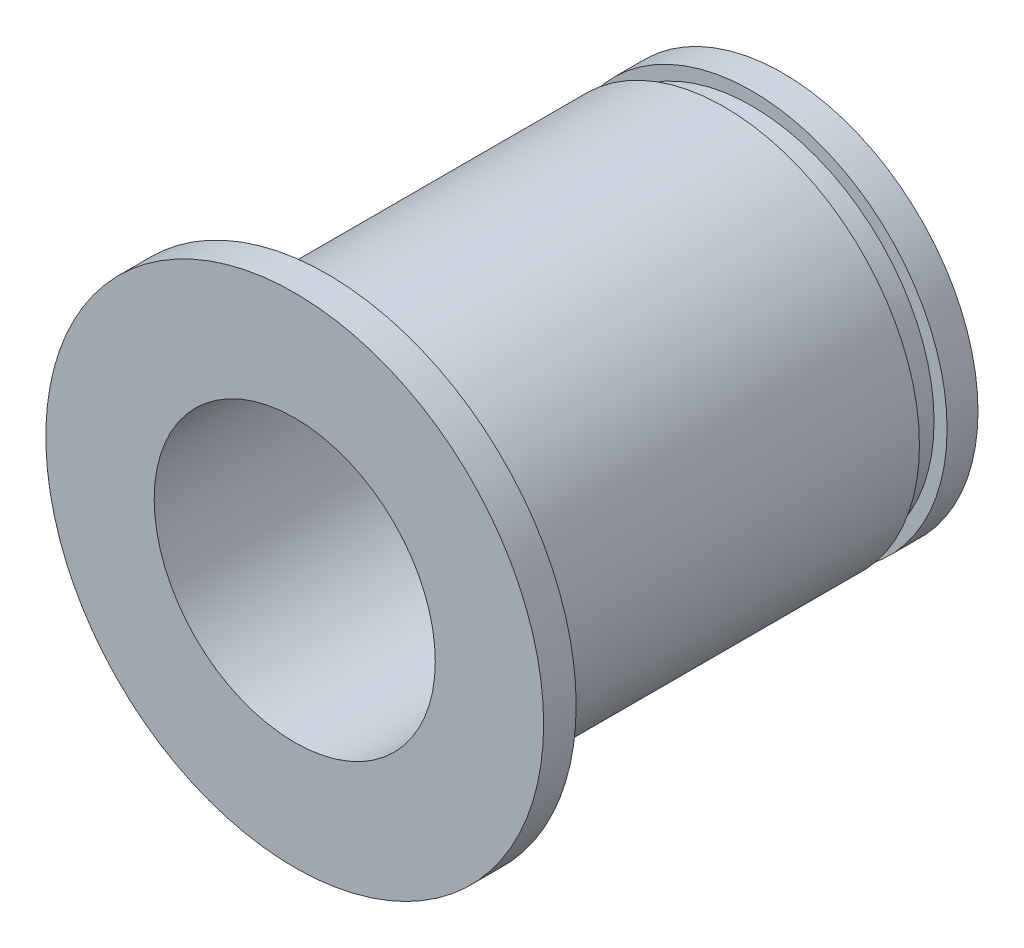
ISO-10303-21;
HEADER;
FILE_DESCRIPTION(('STEP AP214'),'2;1');
FILE_NAME('part.step','',(''),(''),'','','');
FILE_SCHEMA(('AUTOMOTIVE_DESIGN { 1 0 10303 214 1 1 1 1 }'));
ENDSEC;
DATA;
#1=APPLICATION_CONTEXT('core data for automotive mechanical design processes');
#2=APPLICATION_PROTOCOL_DEFINITION('international standard','automotive_design',2000,#1);
#3=PRODUCT_CONTEXT('',#1,'mechanical');
#4=PRODUCT('Part','Part','',(#3));
#5=PRODUCT_RELATED_PRODUCT_CATEGORY('part','',(#4));
#6=PRODUCT_DEFINITION_FORMATION('','',#4);
#7=PRODUCT_DEFINITION_CONTEXT('part definition',#1,'design');
#8=PRODUCT_DEFINITION('design','',#6,#7);
#9=PRODUCT_DEFINITION_SHAPE('','',#8);
#10=(LENGTH_UNIT() NAMED_UNIT(*) SI_UNIT(.MILLI.,.METRE.));
#11=(NAMED_UNIT(*) PLANE_ANGLE_UNIT() SI_UNIT($,.RADIAN.));
#12=(NAMED_UNIT(*) SI_UNIT($,.STERADIAN.) SOLID_ANGLE_UNIT());
#13=UNCERTAINTY_MEASURE_WITH_UNIT(LENGTH_MEASURE(1.E-05),#10,'distance_accuracy_value','');
#14=(GEOMETRIC_REPRESENTATION_CONTEXT(3) GLOBAL_UNCERTAINTY_ASSIGNED_CONTEXT((#13)) GLOBAL_UNIT_ASSIGNED_CONTEXT((#10,
#11,#12)) REPRESENTATION_CONTEXT('',''));
#15=CARTESIAN_POINT('',(0.,0.,0.));
#16=DIRECTION('',(0.,0.,1.));
#17=DIRECTION('',(1.,0.,0.));
#18=AXIS2_PLACEMENT_3D('',#15,#16,#17);
#19=CARTESIAN_POINT('',(0.,0.,12.));
#20=DIRECTION('',(0.,0.,-1.));
#21=DIRECTION('',(-1.,0.,0.));
#22=AXIS2_PLACEMENT_3D('',#19,#20,#21);
#23=CYLINDRICAL_SURFACE('',#22,6.);
#24=CARTESIAN_POINT('',(0.,0.,-2.));
#25=DIRECTION('',(0.,0.,1.));
#26=DIRECTION('',(1.,0.,0.));
#27=AXIS2_PLACEMENT_3D('',#24,#25,#26);
#28=CIRCLE('',#27,6.);
#29=CARTESIAN_POINT('',(6.,0.,-2.));
#30=VERTEX_POINT('',#29);
#31=EDGE_CURVE('E44',#30,#30,#28,.T.);
#32=ORIENTED_EDGE('',*,*,#31,.T.);
#33=EDGE_LOOP('',(#32));
#34=FACE_BOUND('',#33,.T.);
#35=CARTESIAN_POINT('',(0.,0.,-1.05));
#36=DIRECTION('',(0.,0.,1.));
#37=DIRECTION('',(1.,0.,0.));
#38=AXIS2_PLACEMENT_3D('',#35,#36,#37);
#39=CIRCLE('',#38,6.);
#40=CARTESIAN_POINT('',(6.,0.,-1.05));
#41=VERTEX_POINT('',#40);
#42=EDGE_CURVE('E53',#41,#41,#39,.T.);
#43=ORIENTED_EDGE('',*,*,#42,.F.);
#44=EDGE_LOOP('',(#43));
#45=FACE_BOUND('',#44,.T.);
#46=ADVANCED_FACE('F40',(#34,#45),#23,.T.);
#47=CARTESIAN_POINT('',(0.,0.,-2.));
#48=DIRECTION('',(0.,0.,1.));
#49=DIRECTION('',(1.,0.,0.));
#50=AXIS2_PLACEMENT_3D('',#47,#48,#49);
#51=PLANE('',#50);
#52=ORIENTED_EDGE('',*,*,#31,.F.);
#53=EDGE_LOOP('',(#52));
#54=FACE_BOUND('',#53,.T.);
#55=CARTESIAN_POINT('',(0.,0.,-2.));
#56=DIRECTION('',(0.,0.,1.));
#57=DIRECTION('',(1.,0.,0.));
#58=AXIS2_PLACEMENT_3D('',#55,#56,#57);
#59=CIRCLE('',#58,4.32);
#60=CARTESIAN_POINT('',(4.32,0.,-2.));
#61=VERTEX_POINT('',#60);
#62=EDGE_CURVE('E49',#61,#61,#59,.T.);
#63=ORIENTED_EDGE('',*,*,#62,.T.);
#64=EDGE_LOOP('',(#63));
#65=FACE_BOUND('',#64,.T.);
#66=ADVANCED_FACE('F94',(#54,#65),#51,.F.);
#67=CARTESIAN_POINT('',(0.,0.,-0.200000000000001));
#68=DIRECTION('',(0.,0.,1.));
#69=DIRECTION('',(1.,0.,0.));
#70=AXIS2_PLACEMENT_3D('',#67,#68,#69);
#71=CIRCLE('',#70,6.);
#72=CARTESIAN_POINT('',(6.,0.,-0.200000000000001));
#73=VERTEX_POINT('',#72);
#74=EDGE_CURVE('E41',#73,#73,#71,.T.);
#75=ORIENTED_EDGE('',*,*,#74,.T.);
#76=EDGE_LOOP('',(#75));
#77=FACE_BOUND('',#76,.T.);
#78=CARTESIAN_POINT('',(0.,0.,12.));
#79=DIRECTION('',(0.,0.,1.));
#80=DIRECTION('',(1.,0.,0.));
#81=AXIS2_PLACEMENT_3D('',#78,#79,#80);
#82=CIRCLE('',#81,6.);
#83=CARTESIAN_POINT('',(6.,0.,12.));
#84=VERTEX_POINT('',#83);
#85=EDGE_CURVE('E10',#84,#84,#82,.T.);
#86=ORIENTED_EDGE('',*,*,#85,.F.);
#87=EDGE_LOOP('',(#86));
#88=FACE_BOUND('',#87,.T.);
#89=ADVANCED_FACE('F39',(#77,#88),#23,.T.);
#90=CARTESIAN_POINT('',(0.,0.,12.));
#91=DIRECTION('',(0.,0.,-1.));
#92=DIRECTION('',(-1.,0.,0.));
#93=AXIS2_PLACEMENT_3D('',#90,#91,#92);
#94=CYLINDRICAL_SURFACE('',#93,4.32);
#95=ORIENTED_EDGE('',*,*,#62,.F.);
#96=EDGE_LOOP('',(#95));
#97=FACE_BOUND('',#96,.T.);
#98=CARTESIAN_POINT('',(0.,0.,13.));
#99=DIRECTION('',(0.,0.,1.));
#100=DIRECTION('',(1.,0.,0.));
#101=AXIS2_PLACEMENT_3D('',#98,#99,#100);
#102=CIRCLE('',#101,4.32);
#103=CARTESIAN_POINT('',(4.32,0.,13.));
#104=VERTEX_POINT('',#103);
#105=EDGE_CURVE('E58',#104,#104,#102,.T.);
#106=ORIENTED_EDGE('',*,*,#105,.T.);
#107=EDGE_LOOP('',(#106));
#108=FACE_BOUND('',#107,.T.);
#109=ADVANCED_FACE('F89',(#97,#108),#94,.F.);
#110=CARTESIAN_POINT('',(0.,0.,13.));
#111=DIRECTION('',(0.,0.,1.));
#112=DIRECTION('',(1.,0.,0.));
#113=AXIS2_PLACEMENT_3D('',#110,#111,#112);
#114=PLANE('',#113);
#115=CARTESIAN_POINT('',(0.,0.,13.));
#116=DIRECTION('',(0.,0.,1.));
#117=DIRECTION('',(1.,0.,0.));
#118=AXIS2_PLACEMENT_3D('',#115,#116,#117);
#119=CIRCLE('',#118,7.65);
#120=CARTESIAN_POINT('',(7.65,0.,13.));
#121=VERTEX_POINT('',#120);
#122=EDGE_CURVE('E75',#121,#121,#119,.T.);
#123=ORIENTED_EDGE('',*,*,#122,.T.);
#124=EDGE_LOOP('',(#123));
#125=FACE_BOUND('',#124,.T.);
#126=ORIENTED_EDGE('',*,*,#105,.F.);
#127=EDGE_LOOP('',(#126));
#128=FACE_BOUND('',#127,.T.);
#129=ADVANCED_FACE('F81',(#125,#128),#114,.T.);
#130=CARTESIAN_POINT('',(0.,0.,12.));
#131=DIRECTION('',(0.,0.,1.));
#132=DIRECTION('',(1.,0.,0.));
#133=AXIS2_PLACEMENT_3D('',#130,#131,#132);
#134=PLANE('',#133);
#135=ORIENTED_EDGE('',*,*,#85,.T.);
#136=EDGE_LOOP('',(#135));
#137=FACE_BOUND('',#136,.T.);
#138=CARTESIAN_POINT('',(0.,0.,12.));
#139=DIRECTION('',(0.,0.,1.));
#140=DIRECTION('',(1.,0.,0.));
#141=AXIS2_PLACEMENT_3D('',#138,#139,#140);
#142=CIRCLE('',#141,7.65);
#143=CARTESIAN_POINT('',(7.65,0.,12.));
#144=VERTEX_POINT('',#143);
#145=EDGE_CURVE('E72',#144,#144,#142,.T.);
#146=ORIENTED_EDGE('',*,*,#145,.F.);
#147=EDGE_LOOP('',(#146));
#148=FACE_BOUND('',#147,.T.);
#149=ADVANCED_FACE('F80',(#137,#148),#134,.F.);
#150=CARTESIAN_POINT('',(0.,0.,13.));
#151=DIRECTION('',(0.,0.,-1.));
#152=DIRECTION('',(-1.,0.,0.));
#153=AXIS2_PLACEMENT_3D('',#150,#151,#152);
#154=CYLINDRICAL_SURFACE('',#153,7.65);
#155=ORIENTED_EDGE('',*,*,#122,.F.);
#156=EDGE_LOOP('',(#155));
#157=FACE_BOUND('',#156,.T.);
#158=ORIENTED_EDGE('',*,*,#145,.T.);
#159=EDGE_LOOP('',(#158));
#160=FACE_BOUND('',#159,.T.);
#161=ADVANCED_FACE('F79',(#157,#160),#154,.T.);
#162=CARTESIAN_POINT('',(0.,0.,-0.2));
#163=DIRECTION('',(0.,0.,1.));
#164=DIRECTION('',(1.,0.,0.));
#165=AXIS2_PLACEMENT_3D('',#162,#163,#164);
#166=PLANE('',#165);
#167=CARTESIAN_POINT('',(0.,0.,-0.2));
#168=DIRECTION('',(0.,0.,1.));
#169=DIRECTION('',(1.,0.,0.));
#170=AXIS2_PLACEMENT_3D('',#167,#168,#169);
#171=CIRCLE('',#170,5.6);
#172=CARTESIAN_POINT('',(5.6,0.,-0.2));
#173=VERTEX_POINT('',#172);
#174=EDGE_CURVE('E57',#173,#173,#171,.T.);
#175=ORIENTED_EDGE('',*,*,#174,.T.);
#176=EDGE_LOOP('',(#175));
#177=FACE_BOUND('',#176,.T.);
#178=ORIENTED_EDGE('',*,*,#74,.F.);
#179=EDGE_LOOP('',(#178));
#180=FACE_BOUND('',#179,.T.);
#181=ADVANCED_FACE('F87',(#177,#180),#166,.F.);
#182=CARTESIAN_POINT('',(0.,0.,-1.05));
#183=DIRECTION('',(0.,0.,1.));
#184=DIRECTION('',(1.,0.,0.));
#185=AXIS2_PLACEMENT_3D('',#182,#183,#184);
#186=PLANE('',#185);
#187=CARTESIAN_POINT('',(0.,0.,-1.05));
#188=DIRECTION('',(0.,0.,1.));
#189=DIRECTION('',(1.,0.,0.));
#190=AXIS2_PLACEMENT_3D('',#187,#188,#189);
#191=CIRCLE('',#190,5.6);
#192=CARTESIAN_POINT('',(5.6,0.,-1.05));
#193=VERTEX_POINT('',#192);
#194=EDGE_CURVE('E64',#193,#193,#191,.T.);
#195=ORIENTED_EDGE('',*,*,#194,.F.);
#196=EDGE_LOOP('',(#195));
#197=FACE_BOUND('',#196,.T.);
#198=ORIENTED_EDGE('',*,*,#42,.T.);
#199=EDGE_LOOP('',(#198));
#200=FACE_BOUND('',#199,.T.);
#201=ADVANCED_FACE('F115',(#197,#200),#186,.T.);
#202=CARTESIAN_POINT('',(0.,0.,-0.2));
#203=DIRECTION('',(0.,0.,-1.));
#204=DIRECTION('',(-1.,0.,0.));
#205=AXIS2_PLACEMENT_3D('',#202,#203,#204);
#206=CYLINDRICAL_SURFACE('',#205,5.6);
#207=ORIENTED_EDGE('',*,*,#174,.F.);
#208=EDGE_LOOP('',(#207));
#209=FACE_BOUND('',#208,.T.);
#210=ORIENTED_EDGE('',*,*,#194,.T.);
#211=EDGE_LOOP('',(#210));
#212=FACE_BOUND('',#211,.T.);
#213=ADVANCED_FACE('F119',(#209,#212),#206,.T.);
#214=CLOSED_SHELL('',(#46,#66,#89,#109,#129,#149,#161,#181,#201,#213));
#215=MANIFOLD_SOLID_BREP('B2',#214);
#216=ADVANCED_BREP_SHAPE_REPRESENTATION('',(#18,#215),#14);
#217=SHAPE_DEFINITION_REPRESENTATION(#9,#216);
ENDSEC;
END-ISO-10303-21;
